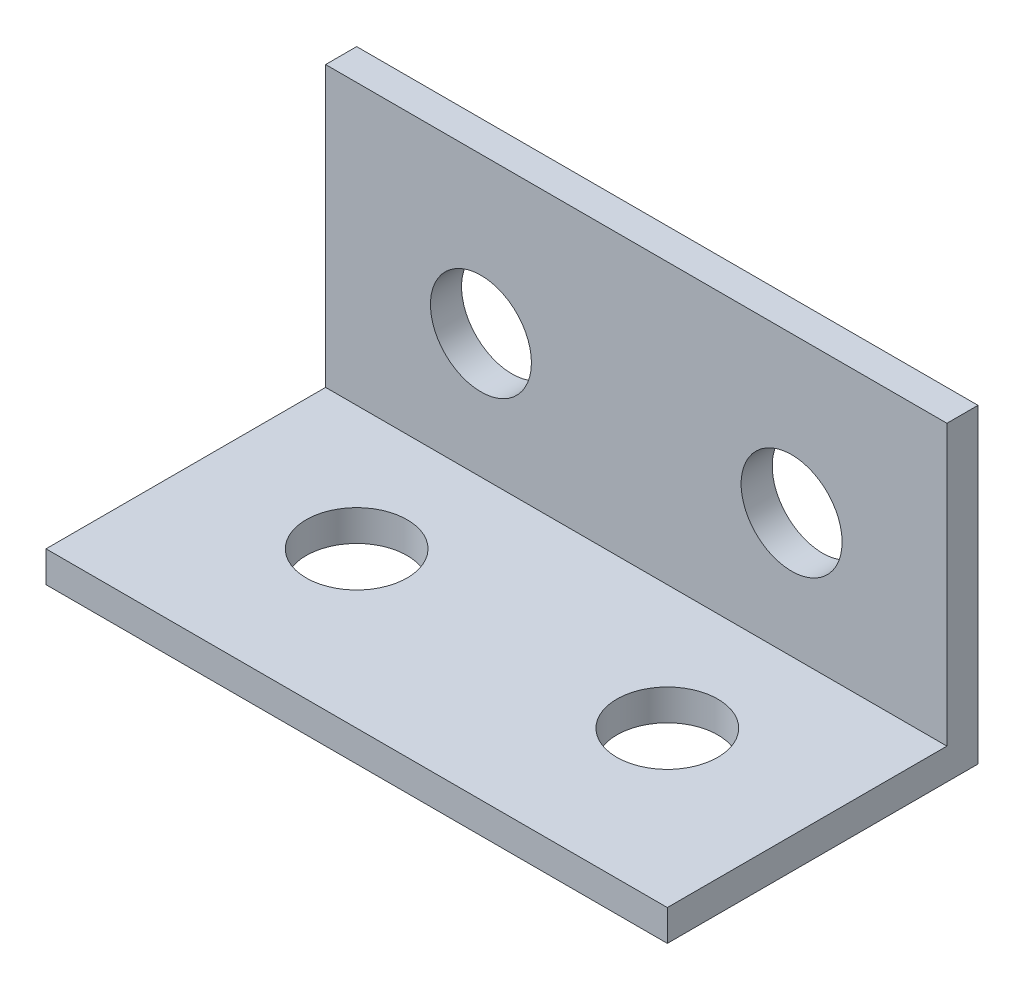
ISO-10303-21;
HEADER;
FILE_DESCRIPTION(('STEP AP214'),'2;1');
FILE_NAME('part.step','',(''),(''),'','','');
FILE_SCHEMA(('AUTOMOTIVE_DESIGN { 1 0 10303 214 1 1 1 1 }'));
ENDSEC;
DATA;
#1=APPLICATION_CONTEXT('core data for automotive mechanical design processes');
#2=APPLICATION_PROTOCOL_DEFINITION('international standard','automotive_design',2000,#1);
#3=PRODUCT_CONTEXT('',#1,'mechanical');
#4=PRODUCT('Part','Part','',(#3));
#5=PRODUCT_RELATED_PRODUCT_CATEGORY('part','',(#4));
#6=PRODUCT_DEFINITION_FORMATION('','',#4);
#7=PRODUCT_DEFINITION_CONTEXT('part definition',#1,'design');
#8=PRODUCT_DEFINITION('design','',#6,#7);
#9=PRODUCT_DEFINITION_SHAPE('','',#8);
#10=(LENGTH_UNIT() NAMED_UNIT(*) SI_UNIT(.MILLI.,.METRE.));
#11=(NAMED_UNIT(*) PLANE_ANGLE_UNIT() SI_UNIT($,.RADIAN.));
#12=(NAMED_UNIT(*) SI_UNIT($,.STERADIAN.) SOLID_ANGLE_UNIT());
#13=UNCERTAINTY_MEASURE_WITH_UNIT(LENGTH_MEASURE(1.E-05),#10,'distance_accuracy_value','');
#14=(GEOMETRIC_REPRESENTATION_CONTEXT(3) GLOBAL_UNCERTAINTY_ASSIGNED_CONTEXT((#13)) GLOBAL_UNIT_ASSIGNED_CONTEXT((#10,
#11,#12)) REPRESENTATION_CONTEXT('',''));
#15=CARTESIAN_POINT('',(0.,0.,0.));
#16=DIRECTION('',(0.,0.,1.));
#17=DIRECTION('',(1.,0.,0.));
#18=AXIS2_PLACEMENT_3D('',#15,#16,#17);
#19=CARTESIAN_POINT('',(0.,0.,2.));
#20=DIRECTION('',(0.,0.,-1.));
#21=DIRECTION('',(-1.,0.,0.));
#22=AXIS2_PLACEMENT_3D('',#19,#20,#21);
#23=PLANE('',#22);
#24=CARTESIAN_POINT('',(10.,10.,2.));
#25=DIRECTION('',(0.,0.,1.));
#26=DIRECTION('',(1.,0.,0.));
#27=AXIS2_PLACEMENT_3D('',#24,#25,#26);
#28=CIRCLE('',#27,3.25);
#29=CARTESIAN_POINT('',(13.25,10.,2.));
#30=VERTEX_POINT('',#29);
#31=EDGE_CURVE('E95',#30,#30,#28,.T.);
#32=ORIENTED_EDGE('',*,*,#31,.F.);
#33=EDGE_LOOP('',(#32));
#34=FACE_BOUND('',#33,.T.);
#35=DIRECTION('',(0.,-1.,0.));
#36=VECTOR('',#35,1.);
#37=CARTESIAN_POINT('',(0.,0.,2.));
#38=LINE('',#37,#36);
#39=CARTESIAN_POINT('',(0.,20.,2.));
#40=VERTEX_POINT('',#39);
#41=CARTESIAN_POINT('',(0.,2.,2.));
#42=VERTEX_POINT('',#41);
#43=EDGE_CURVE('E50',#40,#42,#38,.T.);
#44=ORIENTED_EDGE('',*,*,#43,.T.);
#45=DIRECTION('',(1.,0.,0.));
#46=VECTOR('',#45,1.);
#47=CARTESIAN_POINT('',(0.,2.,2.));
#48=LINE('',#47,#46);
#49=CARTESIAN_POINT('',(40.,2.,2.));
#50=VERTEX_POINT('',#49);
#51=EDGE_CURVE('E146',#42,#50,#48,.T.);
#52=ORIENTED_EDGE('',*,*,#51,.T.);
#53=DIRECTION('',(0.,1.,0.));
#54=VECTOR('',#53,1.);
#55=CARTESIAN_POINT('',(40.,0.,2.));
#56=LINE('',#55,#54);
#57=CARTESIAN_POINT('',(40.,20.,2.));
#58=VERTEX_POINT('',#57);
#59=EDGE_CURVE('E156',#50,#58,#56,.T.);
#60=ORIENTED_EDGE('',*,*,#59,.T.);
#61=DIRECTION('',(-1.,0.,0.));
#62=VECTOR('',#61,1.);
#63=CARTESIAN_POINT('',(0.,20.,2.));
#64=LINE('',#63,#62);
#65=EDGE_CURVE('E56',#58,#40,#64,.T.);
#66=ORIENTED_EDGE('',*,*,#65,.T.);
#67=EDGE_LOOP('',(#44,#52,#60,#66));
#68=FACE_BOUND('',#67,.T.);
#69=CARTESIAN_POINT('',(30.,10.,2.));
#70=DIRECTION('',(0.,0.,1.));
#71=DIRECTION('',(1.,0.,0.));
#72=AXIS2_PLACEMENT_3D('',#69,#70,#71);
#73=CIRCLE('',#72,3.25);
#74=CARTESIAN_POINT('',(33.25,10.,2.));
#75=VERTEX_POINT('',#74);
#76=EDGE_CURVE('E149',#75,#75,#73,.T.);
#77=ORIENTED_EDGE('',*,*,#76,.F.);
#78=EDGE_LOOP('',(#77));
#79=FACE_BOUND('',#78,.T.);
#80=ADVANCED_FACE('F35',(#34,#68,#79),#23,.F.);
#81=CARTESIAN_POINT('',(0.,0.,0.));
#82=DIRECTION('',(0.,0.,-1.));
#83=DIRECTION('',(-1.,0.,0.));
#84=AXIS2_PLACEMENT_3D('',#81,#82,#83);
#85=PLANE('',#84);
#86=DIRECTION('',(-1.,0.,0.));
#87=VECTOR('',#86,1.);
#88=CARTESIAN_POINT('',(0.,20.,0.));
#89=LINE('',#88,#87);
#90=CARTESIAN_POINT('',(40.,20.,0.));
#91=VERTEX_POINT('',#90);
#92=CARTESIAN_POINT('',(0.,20.,0.));
#93=VERTEX_POINT('',#92);
#94=EDGE_CURVE('E75',#91,#93,#89,.T.);
#95=ORIENTED_EDGE('',*,*,#94,.F.);
#96=DIRECTION('',(0.,1.,0.));
#97=VECTOR('',#96,1.);
#98=CARTESIAN_POINT('',(40.,0.,0.));
#99=LINE('',#98,#97);
#100=CARTESIAN_POINT('',(40.,0.,0.));
#101=VERTEX_POINT('',#100);
#102=EDGE_CURVE('E84',#101,#91,#99,.T.);
#103=ORIENTED_EDGE('',*,*,#102,.F.);
#104=DIRECTION('',(1.,0.,0.));
#105=VECTOR('',#104,1.);
#106=CARTESIAN_POINT('',(0.,0.,0.));
#107=LINE('',#106,#105);
#108=CARTESIAN_POINT('',(0.,0.,0.));
#109=VERTEX_POINT('',#108);
#110=EDGE_CURVE('E94',#109,#101,#107,.T.);
#111=ORIENTED_EDGE('',*,*,#110,.F.);
#112=DIRECTION('',(0.,-1.,0.));
#113=VECTOR('',#112,1.);
#114=CARTESIAN_POINT('',(0.,0.,0.));
#115=LINE('',#114,#113);
#116=EDGE_CURVE('E88',#93,#109,#115,.T.);
#117=ORIENTED_EDGE('',*,*,#116,.F.);
#118=EDGE_LOOP('',(#95,#103,#111,#117));
#119=FACE_BOUND('',#118,.T.);
#120=CARTESIAN_POINT('',(10.,10.,0.));
#121=DIRECTION('',(0.,0.,1.));
#122=DIRECTION('',(1.,0.,0.));
#123=AXIS2_PLACEMENT_3D('',#120,#121,#122);
#124=CIRCLE('',#123,3.25);
#125=CARTESIAN_POINT('',(13.25,10.,0.));
#126=VERTEX_POINT('',#125);
#127=EDGE_CURVE('E99',#126,#126,#124,.T.);
#128=ORIENTED_EDGE('',*,*,#127,.T.);
#129=EDGE_LOOP('',(#128));
#130=FACE_BOUND('',#129,.T.);
#131=CARTESIAN_POINT('',(30.,10.,0.));
#132=DIRECTION('',(0.,0.,1.));
#133=DIRECTION('',(1.,0.,0.));
#134=AXIS2_PLACEMENT_3D('',#131,#132,#133);
#135=CIRCLE('',#134,3.25);
#136=CARTESIAN_POINT('',(33.25,10.,0.));
#137=VERTEX_POINT('',#136);
#138=EDGE_CURVE('E148',#137,#137,#135,.T.);
#139=ORIENTED_EDGE('',*,*,#138,.T.);
#140=EDGE_LOOP('',(#139));
#141=FACE_BOUND('',#140,.T.);
#142=ADVANCED_FACE('F92',(#119,#130,#141),#85,.T.);
#143=CARTESIAN_POINT('',(0.,0.,2.));
#144=DIRECTION('',(1.,0.,0.));
#145=DIRECTION('',(0.,0.,-1.));
#146=AXIS2_PLACEMENT_3D('',#143,#144,#145);
#147=PLANE('',#146);
#148=ORIENTED_EDGE('',*,*,#116,.T.);
#149=DIRECTION('',(0.,0.,-1.));
#150=VECTOR('',#149,1.);
#151=CARTESIAN_POINT('',(0.,0.,2.));
#152=LINE('',#151,#150);
#153=CARTESIAN_POINT('',(0.,0.,20.));
#154=VERTEX_POINT('',#153);
#155=EDGE_CURVE('E11',#154,#109,#152,.T.);
#156=ORIENTED_EDGE('',*,*,#155,.F.);
#157=DIRECTION('',(0.,-1.,0.));
#158=VECTOR('',#157,1.);
#159=CARTESIAN_POINT('',(0.,2.,20.));
#160=LINE('',#159,#158);
#161=CARTESIAN_POINT('',(0.,2.,20.));
#162=VERTEX_POINT('',#161);
#163=EDGE_CURVE('E130',#162,#154,#160,.T.);
#164=ORIENTED_EDGE('',*,*,#163,.F.);
#165=DIRECTION('',(0.,0.,1.));
#166=VECTOR('',#165,1.);
#167=CARTESIAN_POINT('',(0.,2.,0.));
#168=LINE('',#167,#166);
#169=EDGE_CURVE('E131',#42,#162,#168,.T.);
#170=ORIENTED_EDGE('',*,*,#169,.F.);
#171=ORIENTED_EDGE('',*,*,#43,.F.);
#172=DIRECTION('',(0.,0.,-1.));
#173=VECTOR('',#172,1.);
#174=CARTESIAN_POINT('',(0.,20.,2.));
#175=LINE('',#174,#173);
#176=EDGE_CURVE('E78',#40,#93,#175,.T.);
#177=ORIENTED_EDGE('',*,*,#176,.T.);
#178=EDGE_LOOP('',(#148,#156,#164,#170,#171,#177));
#179=FACE_BOUND('',#178,.T.);
#180=ADVANCED_FACE('F37',(#179),#147,.F.);
#181=CARTESIAN_POINT('',(0.,0.,2.));
#182=DIRECTION('',(0.,1.,0.));
#183=DIRECTION('',(0.,0.,1.));
#184=AXIS2_PLACEMENT_3D('',#181,#182,#183);
#185=PLANE('',#184);
#186=ORIENTED_EDGE('',*,*,#110,.T.);
#187=DIRECTION('',(0.,0.,-1.));
#188=VECTOR('',#187,1.);
#189=CARTESIAN_POINT('',(40.,0.,2.));
#190=LINE('',#189,#188);
#191=CARTESIAN_POINT('',(40.,0.,20.));
#192=VERTEX_POINT('',#191);
#193=EDGE_CURVE('E43',#192,#101,#190,.T.);
#194=ORIENTED_EDGE('',*,*,#193,.F.);
#195=DIRECTION('',(1.,0.,0.));
#196=VECTOR('',#195,1.);
#197=CARTESIAN_POINT('',(0.,0.,20.));
#198=LINE('',#197,#196);
#199=EDGE_CURVE('E121',#154,#192,#198,.T.);
#200=ORIENTED_EDGE('',*,*,#199,.F.);
#201=ORIENTED_EDGE('',*,*,#155,.T.);
#202=EDGE_LOOP('',(#186,#194,#200,#201));
#203=FACE_BOUND('',#202,.T.);
#204=CARTESIAN_POINT('',(30.,0.,10.));
#205=DIRECTION('',(0.,1.,0.));
#206=DIRECTION('',(0.,0.,1.));
#207=AXIS2_PLACEMENT_3D('',#204,#205,#206);
#208=CIRCLE('',#207,3.25);
#209=CARTESIAN_POINT('',(30.,0.,13.25));
#210=VERTEX_POINT('',#209);
#211=EDGE_CURVE('E169',#210,#210,#208,.T.);
#212=ORIENTED_EDGE('',*,*,#211,.T.);
#213=EDGE_LOOP('',(#212));
#214=FACE_BOUND('',#213,.T.);
#215=CARTESIAN_POINT('',(10.,0.,10.));
#216=DIRECTION('',(0.,1.,0.));
#217=DIRECTION('',(0.,0.,1.));
#218=AXIS2_PLACEMENT_3D('',#215,#216,#217);
#219=CIRCLE('',#218,3.25);
#220=CARTESIAN_POINT('',(10.,0.,13.25));
#221=VERTEX_POINT('',#220);
#222=EDGE_CURVE('E138',#221,#221,#219,.T.);
#223=ORIENTED_EDGE('',*,*,#222,.T.);
#224=EDGE_LOOP('',(#223));
#225=FACE_BOUND('',#224,.T.);
#226=ADVANCED_FACE('F118',(#203,#214,#225),#185,.F.);
#227=CARTESIAN_POINT('',(40.,0.,2.));
#228=DIRECTION('',(-1.,0.,0.));
#229=DIRECTION('',(0.,0.,1.));
#230=AXIS2_PLACEMENT_3D('',#227,#228,#229);
#231=PLANE('',#230);
#232=ORIENTED_EDGE('',*,*,#59,.F.);
#233=DIRECTION('',(0.,0.,-1.));
#234=VECTOR('',#233,1.);
#235=CARTESIAN_POINT('',(40.,2.,0.));
#236=LINE('',#235,#234);
#237=CARTESIAN_POINT('',(40.,2.,20.));
#238=VERTEX_POINT('',#237);
#239=EDGE_CURVE('E142',#238,#50,#236,.T.);
#240=ORIENTED_EDGE('',*,*,#239,.F.);
#241=DIRECTION('',(0.,-1.,0.));
#242=VECTOR('',#241,1.);
#243=CARTESIAN_POINT('',(40.,2.,20.));
#244=LINE('',#243,#242);
#245=EDGE_CURVE('E114',#238,#192,#244,.T.);
#246=ORIENTED_EDGE('',*,*,#245,.T.);
#247=ORIENTED_EDGE('',*,*,#193,.T.);
#248=ORIENTED_EDGE('',*,*,#102,.T.);
#249=DIRECTION('',(0.,0.,-1.));
#250=VECTOR('',#249,1.);
#251=CARTESIAN_POINT('',(40.,20.,2.));
#252=LINE('',#251,#250);
#253=EDGE_CURVE('E80',#58,#91,#252,.T.);
#254=ORIENTED_EDGE('',*,*,#253,.F.);
#255=EDGE_LOOP('',(#232,#240,#246,#247,#248,#254));
#256=FACE_BOUND('',#255,.T.);
#257=ADVANCED_FACE('F110',(#256),#231,.F.);
#258=CARTESIAN_POINT('',(0.,20.,2.));
#259=DIRECTION('',(0.,-1.,0.));
#260=DIRECTION('',(0.,0.,-1.));
#261=AXIS2_PLACEMENT_3D('',#258,#259,#260);
#262=PLANE('',#261);
#263=ORIENTED_EDGE('',*,*,#94,.T.);
#264=ORIENTED_EDGE('',*,*,#176,.F.);
#265=ORIENTED_EDGE('',*,*,#65,.F.);
#266=ORIENTED_EDGE('',*,*,#253,.T.);
#267=EDGE_LOOP('',(#263,#264,#265,#266));
#268=FACE_BOUND('',#267,.T.);
#269=ADVANCED_FACE('F77',(#268),#262,.F.);
#270=CARTESIAN_POINT('',(10.,10.,2.));
#271=DIRECTION('',(0.,0.,-1.));
#272=DIRECTION('',(-1.,0.,0.));
#273=AXIS2_PLACEMENT_3D('',#270,#271,#272);
#274=CYLINDRICAL_SURFACE('',#273,3.25);
#275=ORIENTED_EDGE('',*,*,#31,.T.);
#276=EDGE_LOOP('',(#275));
#277=FACE_BOUND('',#276,.T.);
#278=ORIENTED_EDGE('',*,*,#127,.F.);
#279=EDGE_LOOP('',(#278));
#280=FACE_BOUND('',#279,.T.);
#281=ADVANCED_FACE('F205',(#277,#280),#274,.F.);
#282=CARTESIAN_POINT('',(30.,10.,2.));
#283=DIRECTION('',(0.,0.,-1.));
#284=DIRECTION('',(-1.,0.,0.));
#285=AXIS2_PLACEMENT_3D('',#282,#283,#284);
#286=CYLINDRICAL_SURFACE('',#285,3.25);
#287=ORIENTED_EDGE('',*,*,#76,.T.);
#288=EDGE_LOOP('',(#287));
#289=FACE_BOUND('',#288,.T.);
#290=ORIENTED_EDGE('',*,*,#138,.F.);
#291=EDGE_LOOP('',(#290));
#292=FACE_BOUND('',#291,.T.);
#293=ADVANCED_FACE('F180',(#289,#292),#286,.F.);
#294=CARTESIAN_POINT('',(0.,2.,0.));
#295=DIRECTION('',(0.,1.,0.));
#296=DIRECTION('',(0.,0.,1.));
#297=AXIS2_PLACEMENT_3D('',#294,#295,#296);
#298=PLANE('',#297);
#299=CARTESIAN_POINT('',(30.,2.,10.));
#300=DIRECTION('',(0.,1.,0.));
#301=DIRECTION('',(0.,0.,1.));
#302=AXIS2_PLACEMENT_3D('',#299,#300,#301);
#303=CIRCLE('',#302,3.25);
#304=CARTESIAN_POINT('',(30.,2.,13.25));
#305=VERTEX_POINT('',#304);
#306=EDGE_CURVE('E167',#305,#305,#303,.T.);
#307=ORIENTED_EDGE('',*,*,#306,.F.);
#308=EDGE_LOOP('',(#307));
#309=FACE_BOUND('',#308,.T.);
#310=CARTESIAN_POINT('',(10.,2.,10.));
#311=DIRECTION('',(0.,1.,0.));
#312=DIRECTION('',(0.,0.,1.));
#313=AXIS2_PLACEMENT_3D('',#310,#311,#312);
#314=CIRCLE('',#313,3.25);
#315=CARTESIAN_POINT('',(10.,2.,13.25));
#316=VERTEX_POINT('',#315);
#317=EDGE_CURVE('E132',#316,#316,#314,.T.);
#318=ORIENTED_EDGE('',*,*,#317,.F.);
#319=EDGE_LOOP('',(#318));
#320=FACE_BOUND('',#319,.T.);
#321=ORIENTED_EDGE('',*,*,#51,.F.);
#322=ORIENTED_EDGE('',*,*,#169,.T.);
#323=DIRECTION('',(1.,0.,0.));
#324=VECTOR('',#323,1.);
#325=CARTESIAN_POINT('',(0.,2.,20.));
#326=LINE('',#325,#324);
#327=EDGE_CURVE('E135',#162,#238,#326,.T.);
#328=ORIENTED_EDGE('',*,*,#327,.T.);
#329=ORIENTED_EDGE('',*,*,#239,.T.);
#330=EDGE_LOOP('',(#321,#322,#328,#329));
#331=FACE_BOUND('',#330,.T.);
#332=ADVANCED_FACE('F164',(#309,#320,#331),#298,.T.);
#333=CARTESIAN_POINT('',(0.,2.,20.));
#334=DIRECTION('',(0.,0.,-1.));
#335=DIRECTION('',(-1.,0.,0.));
#336=AXIS2_PLACEMENT_3D('',#333,#334,#335);
#337=PLANE('',#336);
#338=ORIENTED_EDGE('',*,*,#199,.T.);
#339=ORIENTED_EDGE('',*,*,#245,.F.);
#340=ORIENTED_EDGE('',*,*,#327,.F.);
#341=ORIENTED_EDGE('',*,*,#163,.T.);
#342=EDGE_LOOP('',(#338,#339,#340,#341));
#343=FACE_BOUND('',#342,.T.);
#344=ADVANCED_FACE('F126',(#343),#337,.F.);
#345=CARTESIAN_POINT('',(10.,2.,10.));
#346=DIRECTION('',(0.,-1.,0.));
#347=DIRECTION('',(0.,0.,-1.));
#348=AXIS2_PLACEMENT_3D('',#345,#346,#347);
#349=CYLINDRICAL_SURFACE('',#348,3.25);
#350=ORIENTED_EDGE('',*,*,#317,.T.);
#351=EDGE_LOOP('',(#350));
#352=FACE_BOUND('',#351,.T.);
#353=ORIENTED_EDGE('',*,*,#222,.F.);
#354=EDGE_LOOP('',(#353));
#355=FACE_BOUND('',#354,.T.);
#356=ADVANCED_FACE('F184',(#352,#355),#349,.F.);
#357=CARTESIAN_POINT('',(30.,2.,10.));
#358=DIRECTION('',(0.,-1.,0.));
#359=DIRECTION('',(0.,0.,-1.));
#360=AXIS2_PLACEMENT_3D('',#357,#358,#359);
#361=CYLINDRICAL_SURFACE('',#360,3.25);
#362=ORIENTED_EDGE('',*,*,#306,.T.);
#363=EDGE_LOOP('',(#362));
#364=FACE_BOUND('',#363,.T.);
#365=ORIENTED_EDGE('',*,*,#211,.F.);
#366=EDGE_LOOP('',(#365));
#367=FACE_BOUND('',#366,.T.);
#368=ADVANCED_FACE('F175',(#364,#367),#361,.F.);
#369=CLOSED_SHELL('',(#80,#142,#180,#226,#257,#269,#281,#293,#332,#344,#356,#368));
#370=MANIFOLD_SOLID_BREP('B2',#369);
#371=ADVANCED_BREP_SHAPE_REPRESENTATION('',(#18,#370),#14);
#372=SHAPE_DEFINITION_REPRESENTATION(#9,#371);
ENDSEC;
END-ISO-10303-21;
